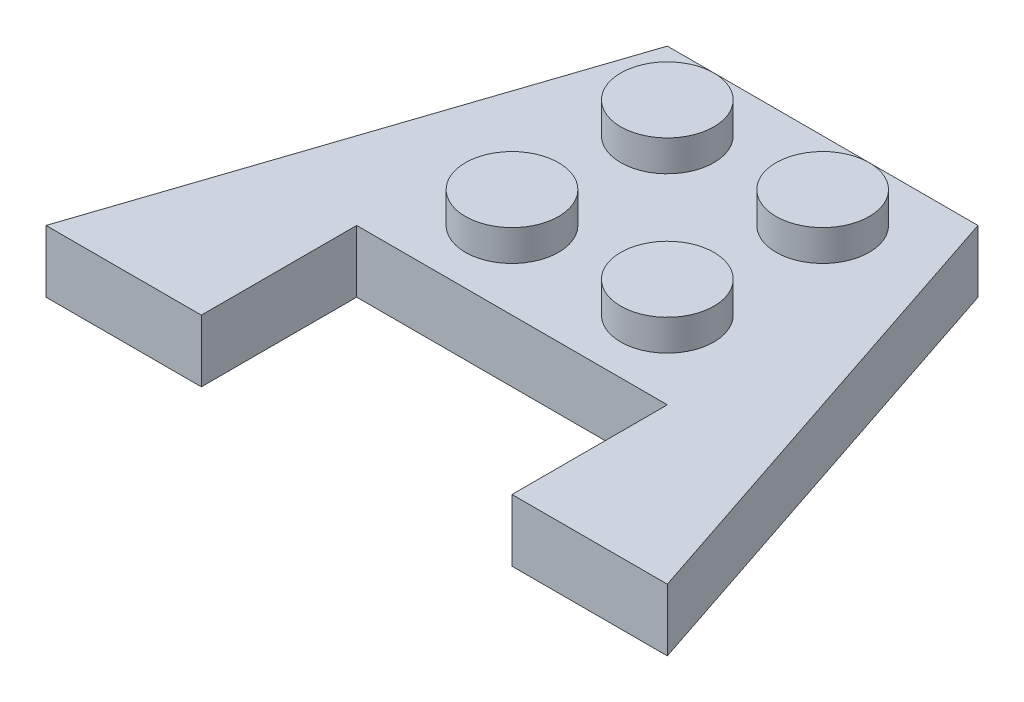
ISO-10303-21;
HEADER;
FILE_DESCRIPTION(('STEP AP214'),'2;1');
FILE_NAME('part.step','',(''),(''),'','','');
FILE_SCHEMA(('AUTOMOTIVE_DESIGN { 1 0 10303 214 1 1 1 1 }'));
ENDSEC;
DATA;
#1=APPLICATION_CONTEXT('core data for automotive mechanical design processes');
#2=APPLICATION_PROTOCOL_DEFINITION('international standard','automotive_design',2000,#1);
#3=PRODUCT_CONTEXT('',#1,'mechanical');
#4=PRODUCT('Part','Part','',(#3));
#5=PRODUCT_RELATED_PRODUCT_CATEGORY('part','',(#4));
#6=PRODUCT_DEFINITION_FORMATION('','',#4);
#7=PRODUCT_DEFINITION_CONTEXT('part definition',#1,'design');
#8=PRODUCT_DEFINITION('design','',#6,#7);
#9=PRODUCT_DEFINITION_SHAPE('','',#8);
#10=(LENGTH_UNIT() NAMED_UNIT(*) SI_UNIT(.MILLI.,.METRE.));
#11=(NAMED_UNIT(*) PLANE_ANGLE_UNIT() SI_UNIT($,.RADIAN.));
#12=(NAMED_UNIT(*) SI_UNIT($,.STERADIAN.) SOLID_ANGLE_UNIT());
#13=UNCERTAINTY_MEASURE_WITH_UNIT(LENGTH_MEASURE(1.E-05),#10,'distance_accuracy_value','');
#14=(GEOMETRIC_REPRESENTATION_CONTEXT(3) GLOBAL_UNCERTAINTY_ASSIGNED_CONTEXT((#13)) GLOBAL_UNIT_ASSIGNED_CONTEXT((#10,
#11,#12)) REPRESENTATION_CONTEXT('',''));
#15=CARTESIAN_POINT('',(0.,0.,0.));
#16=DIRECTION('',(0.,0.,1.));
#17=DIRECTION('',(1.,0.,0.));
#18=AXIS2_PLACEMENT_3D('',#15,#16,#17);
#19=CARTESIAN_POINT('',(20.,4.8,-12.));
#20=DIRECTION('',(0.,1.,0.));
#21=DIRECTION('',(0.,0.,1.));
#22=AXIS2_PLACEMENT_3D('',#19,#20,#21);
#23=PLANE('',#22);
#24=CARTESIAN_POINT('',(20.,4.8,-12.));
#25=DIRECTION('',(0.,1.,0.));
#26=DIRECTION('',(0.,0.,1.));
#27=AXIS2_PLACEMENT_3D('',#24,#25,#26);
#28=CIRCLE('',#27,2.4);
#29=CARTESIAN_POINT('',(20.,4.8,-9.6));
#30=VERTEX_POINT('',#29);
#31=EDGE_CURVE('E11',#30,#30,#28,.T.);
#32=ORIENTED_EDGE('',*,*,#31,.T.);
#33=EDGE_LOOP('',(#32));
#34=FACE_BOUND('',#33,.T.);
#35=ADVANCED_FACE('F38',(#34),#23,.T.);
#36=CARTESIAN_POINT('',(20.,4.8,-12.));
#37=DIRECTION('',(0.,-1.,0.));
#38=DIRECTION('',(0.,0.,-1.));
#39=AXIS2_PLACEMENT_3D('',#36,#37,#38);
#40=CYLINDRICAL_SURFACE('',#39,2.4);
#41=ORIENTED_EDGE('',*,*,#31,.F.);
#42=EDGE_LOOP('',(#41));
#43=FACE_BOUND('',#42,.T.);
#44=CARTESIAN_POINT('',(20.,3.2,-12.));
#45=DIRECTION('',(0.,1.,0.));
#46=DIRECTION('',(0.,0.,1.));
#47=AXIS2_PLACEMENT_3D('',#44,#45,#46);
#48=CIRCLE('',#47,2.4);
#49=CARTESIAN_POINT('',(20.,3.2,-9.6));
#50=VERTEX_POINT('',#49);
#51=EDGE_CURVE('E46',#50,#50,#48,.T.);
#52=ORIENTED_EDGE('',*,*,#51,.T.);
#53=EDGE_LOOP('',(#52));
#54=FACE_BOUND('',#53,.T.);
#55=ADVANCED_FACE('F210',(#43,#54),#40,.T.);
#56=CARTESIAN_POINT('',(12.,4.8,-12.));
#57=DIRECTION('',(0.,1.,0.));
#58=DIRECTION('',(0.,0.,1.));
#59=AXIS2_PLACEMENT_3D('',#56,#57,#58);
#60=PLANE('',#59);
#61=CARTESIAN_POINT('',(12.,4.8,-12.));
#62=DIRECTION('',(0.,1.,0.));
#63=DIRECTION('',(0.,0.,1.));
#64=AXIS2_PLACEMENT_3D('',#61,#62,#63);
#65=CIRCLE('',#64,2.4);
#66=CARTESIAN_POINT('',(12.,4.8,-9.6));
#67=VERTEX_POINT('',#66);
#68=EDGE_CURVE('E203',#67,#67,#65,.T.);
#69=ORIENTED_EDGE('',*,*,#68,.T.);
#70=EDGE_LOOP('',(#69));
#71=FACE_BOUND('',#70,.T.);
#72=ADVANCED_FACE('F234',(#71),#60,.T.);
#73=CARTESIAN_POINT('',(12.,4.8,-12.));
#74=DIRECTION('',(0.,-1.,0.));
#75=DIRECTION('',(0.,0.,-1.));
#76=AXIS2_PLACEMENT_3D('',#73,#74,#75);
#77=CYLINDRICAL_SURFACE('',#76,2.4);
#78=ORIENTED_EDGE('',*,*,#68,.F.);
#79=EDGE_LOOP('',(#78));
#80=FACE_BOUND('',#79,.T.);
#81=CARTESIAN_POINT('',(12.,3.2,-12.));
#82=DIRECTION('',(0.,1.,0.));
#83=DIRECTION('',(0.,0.,1.));
#84=AXIS2_PLACEMENT_3D('',#81,#82,#83);
#85=CIRCLE('',#84,2.4);
#86=CARTESIAN_POINT('',(12.,3.2,-9.6));
#87=VERTEX_POINT('',#86);
#88=EDGE_CURVE('E199',#87,#87,#85,.T.);
#89=ORIENTED_EDGE('',*,*,#88,.T.);
#90=EDGE_LOOP('',(#89));
#91=FACE_BOUND('',#90,.T.);
#92=ADVANCED_FACE('F240',(#80,#91),#77,.T.);
#93=CARTESIAN_POINT('',(0.,3.2,0.));
#94=DIRECTION('',(0.,0.,-1.));
#95=DIRECTION('',(-1.,0.,0.));
#96=AXIS2_PLACEMENT_3D('',#93,#94,#95);
#97=PLANE('',#96);
#98=DIRECTION('',(1.,0.,0.));
#99=VECTOR('',#98,1.);
#100=CARTESIAN_POINT('',(0.,0.,0.));
#101=LINE('',#100,#99);
#102=CARTESIAN_POINT('',(0.,0.,0.));
#103=VERTEX_POINT('',#102);
#104=CARTESIAN_POINT('',(8.,0.,0.));
#105=VERTEX_POINT('',#104);
#106=EDGE_CURVE('E153',#103,#105,#101,.T.);
#107=ORIENTED_EDGE('',*,*,#106,.T.);
#108=DIRECTION('',(0.,-1.,0.));
#109=VECTOR('',#108,1.);
#110=CARTESIAN_POINT('',(8.,3.2,0.));
#111=LINE('',#110,#109);
#112=CARTESIAN_POINT('',(8.,3.2,0.));
#113=VERTEX_POINT('',#112);
#114=EDGE_CURVE('E196',#113,#105,#111,.T.);
#115=ORIENTED_EDGE('',*,*,#114,.F.);
#116=DIRECTION('',(1.,0.,0.));
#117=VECTOR('',#116,1.);
#118=CARTESIAN_POINT('',(0.,3.2,0.));
#119=LINE('',#118,#117);
#120=CARTESIAN_POINT('',(0.,3.2,0.));
#121=VERTEX_POINT('',#120);
#122=EDGE_CURVE('E177',#121,#113,#119,.T.);
#123=ORIENTED_EDGE('',*,*,#122,.F.);
#124=DIRECTION('',(0.,-1.,0.));
#125=VECTOR('',#124,1.);
#126=CARTESIAN_POINT('',(0.,3.2,0.));
#127=LINE('',#126,#125);
#128=EDGE_CURVE('E149',#121,#103,#127,.T.);
#129=ORIENTED_EDGE('',*,*,#128,.T.);
#130=EDGE_LOOP('',(#107,#115,#123,#129));
#131=FACE_BOUND('',#130,.T.);
#132=ADVANCED_FACE('F246',(#131),#97,.F.);
#133=CARTESIAN_POINT('',(8.,3.2,0.));
#134=DIRECTION('',(-1.,0.,0.));
#135=DIRECTION('',(0.,0.,1.));
#136=AXIS2_PLACEMENT_3D('',#133,#134,#135);
#137=PLANE('',#136);
#138=DIRECTION('',(0.,0.,-1.));
#139=VECTOR('',#138,1.);
#140=CARTESIAN_POINT('',(8.,0.,0.));
#141=LINE('',#140,#139);
#142=CARTESIAN_POINT('',(8.,0.,-8.));
#143=VERTEX_POINT('',#142);
#144=EDGE_CURVE('E157',#105,#143,#141,.T.);
#145=ORIENTED_EDGE('',*,*,#144,.T.);
#146=DIRECTION('',(0.,-1.,0.));
#147=VECTOR('',#146,1.);
#148=CARTESIAN_POINT('',(8.,3.2,-8.));
#149=LINE('',#148,#147);
#150=CARTESIAN_POINT('',(8.,3.2,-8.));
#151=VERTEX_POINT('',#150);
#152=EDGE_CURVE('E192',#151,#143,#149,.T.);
#153=ORIENTED_EDGE('',*,*,#152,.F.);
#154=DIRECTION('',(0.,0.,-1.));
#155=VECTOR('',#154,1.);
#156=CARTESIAN_POINT('',(8.,3.2,0.));
#157=LINE('',#156,#155);
#158=EDGE_CURVE('E104',#113,#151,#157,.T.);
#159=ORIENTED_EDGE('',*,*,#158,.F.);
#160=ORIENTED_EDGE('',*,*,#114,.T.);
#161=EDGE_LOOP('',(#145,#153,#159,#160));
#162=FACE_BOUND('',#161,.T.);
#163=ADVANCED_FACE('F250',(#162),#137,.F.);
#164=CARTESIAN_POINT('',(8.,3.2,-8.));
#165=DIRECTION('',(0.,0.,-1.));
#166=DIRECTION('',(-1.,0.,0.));
#167=AXIS2_PLACEMENT_3D('',#164,#165,#166);
#168=PLANE('',#167);
#169=DIRECTION('',(1.,0.,0.));
#170=VECTOR('',#169,1.);
#171=CARTESIAN_POINT('',(8.,0.,-8.));
#172=LINE('',#171,#170);
#173=CARTESIAN_POINT('',(24.,0.,-8.));
#174=VERTEX_POINT('',#173);
#175=EDGE_CURVE('E161',#143,#174,#172,.T.);
#176=ORIENTED_EDGE('',*,*,#175,.T.);
#177=DIRECTION('',(0.,-1.,0.));
#178=VECTOR('',#177,1.);
#179=CARTESIAN_POINT('',(24.,3.2,-8.));
#180=LINE('',#179,#178);
#181=CARTESIAN_POINT('',(24.,3.2,-8.));
#182=VERTEX_POINT('',#181);
#183=EDGE_CURVE('E188',#182,#174,#180,.T.);
#184=ORIENTED_EDGE('',*,*,#183,.F.);
#185=DIRECTION('',(1.,0.,0.));
#186=VECTOR('',#185,1.);
#187=CARTESIAN_POINT('',(8.,3.2,-8.));
#188=LINE('',#187,#186);
#189=EDGE_CURVE('E583',#151,#182,#188,.T.);
#190=ORIENTED_EDGE('',*,*,#189,.F.);
#191=ORIENTED_EDGE('',*,*,#152,.T.);
#192=EDGE_LOOP('',(#176,#184,#190,#191));
#193=FACE_BOUND('',#192,.T.);
#194=ADVANCED_FACE('F254',(#193),#168,.F.);
#195=CARTESIAN_POINT('',(24.,3.2,-8.));
#196=DIRECTION('',(1.,0.,0.));
#197=DIRECTION('',(0.,0.,-1.));
#198=AXIS2_PLACEMENT_3D('',#195,#196,#197);
#199=PLANE('',#198);
#200=DIRECTION('',(0.,0.,1.));
#201=VECTOR('',#200,1.);
#202=CARTESIAN_POINT('',(24.,0.,-8.));
#203=LINE('',#202,#201);
#204=CARTESIAN_POINT('',(24.,0.,0.));
#205=VERTEX_POINT('',#204);
#206=EDGE_CURVE('E164',#174,#205,#203,.T.);
#207=ORIENTED_EDGE('',*,*,#206,.T.);
#208=DIRECTION('',(0.,-1.,0.));
#209=VECTOR('',#208,1.);
#210=CARTESIAN_POINT('',(24.,3.2,0.));
#211=LINE('',#210,#209);
#212=CARTESIAN_POINT('',(24.,3.2,0.));
#213=VERTEX_POINT('',#212);
#214=EDGE_CURVE('E184',#213,#205,#211,.T.);
#215=ORIENTED_EDGE('',*,*,#214,.F.);
#216=DIRECTION('',(0.,0.,1.));
#217=VECTOR('',#216,1.);
#218=CARTESIAN_POINT('',(24.,3.2,-8.));
#219=LINE('',#218,#217);
#220=EDGE_CURVE('E586',#182,#213,#219,.T.);
#221=ORIENTED_EDGE('',*,*,#220,.F.);
#222=ORIENTED_EDGE('',*,*,#183,.T.);
#223=EDGE_LOOP('',(#207,#215,#221,#222));
#224=FACE_BOUND('',#223,.T.);
#225=ADVANCED_FACE('F257',(#224),#199,.F.);
#226=CARTESIAN_POINT('',(24.,3.2,0.));
#227=DIRECTION('',(0.,0.,-1.));
#228=DIRECTION('',(-1.,0.,0.));
#229=AXIS2_PLACEMENT_3D('',#226,#227,#228);
#230=PLANE('',#229);
#231=DIRECTION('',(1.,0.,0.));
#232=VECTOR('',#231,1.);
#233=CARTESIAN_POINT('',(24.,0.,0.));
#234=LINE('',#233,#232);
#235=CARTESIAN_POINT('',(32.,0.,0.));
#236=VERTEX_POINT('',#235);
#237=EDGE_CURVE('E167',#205,#236,#234,.T.);
#238=ORIENTED_EDGE('',*,*,#237,.T.);
#239=DIRECTION('',(0.,-1.,0.));
#240=VECTOR('',#239,1.);
#241=CARTESIAN_POINT('',(32.,3.2,0.));
#242=LINE('',#241,#240);
#243=CARTESIAN_POINT('',(32.,3.2,0.));
#244=VERTEX_POINT('',#243);
#245=EDGE_CURVE('E142',#244,#236,#242,.T.);
#246=ORIENTED_EDGE('',*,*,#245,.F.);
#247=DIRECTION('',(1.,0.,0.));
#248=VECTOR('',#247,1.);
#249=CARTESIAN_POINT('',(24.,3.2,0.));
#250=LINE('',#249,#248);
#251=EDGE_CURVE('E128',#213,#244,#250,.T.);
#252=ORIENTED_EDGE('',*,*,#251,.F.);
#253=ORIENTED_EDGE('',*,*,#214,.T.);
#254=EDGE_LOOP('',(#238,#246,#252,#253));
#255=FACE_BOUND('',#254,.T.);
#256=ADVANCED_FACE('F261',(#255),#230,.F.);
#257=CARTESIAN_POINT('',(24.,3.2,-24.));
#258=DIRECTION('',(-0.948683298050514,0.,0.316227766016838));
#259=DIRECTION('',(0.316227766016838,0.,0.948683298050514));
#260=AXIS2_PLACEMENT_3D('',#257,#258,#259);
#261=PLANE('',#260);
#262=DIRECTION('',(-0.316227766016838,0.,-0.948683298050514));
#263=VECTOR('',#262,1.);
#264=CARTESIAN_POINT('',(24.,0.,-24.));
#265=LINE('',#264,#263);
#266=CARTESIAN_POINT('',(24.,0.,-24.));
#267=VERTEX_POINT('',#266);
#268=EDGE_CURVE('E138',#236,#267,#265,.T.);
#269=ORIENTED_EDGE('',*,*,#268,.T.);
#270=DIRECTION('',(0.,-1.,0.));
#271=VECTOR('',#270,1.);
#272=CARTESIAN_POINT('',(24.,3.2,-24.));
#273=LINE('',#272,#271);
#274=CARTESIAN_POINT('',(24.,3.2,-24.));
#275=VERTEX_POINT('',#274);
#276=EDGE_CURVE('E135',#275,#267,#273,.T.);
#277=ORIENTED_EDGE('',*,*,#276,.F.);
#278=DIRECTION('',(-0.316227766016838,0.,-0.948683298050514));
#279=VECTOR('',#278,1.);
#280=CARTESIAN_POINT('',(24.,3.2,-24.));
#281=LINE('',#280,#279);
#282=EDGE_CURVE('E120',#244,#275,#281,.T.);
#283=ORIENTED_EDGE('',*,*,#282,.F.);
#284=ORIENTED_EDGE('',*,*,#245,.T.);
#285=EDGE_LOOP('',(#269,#277,#283,#284));
#286=FACE_BOUND('',#285,.T.);
#287=ADVANCED_FACE('F136',(#286),#261,.F.);
#288=CARTESIAN_POINT('',(8.,3.2,-24.));
#289=DIRECTION('',(0.,0.,1.));
#290=DIRECTION('',(1.,0.,0.));
#291=AXIS2_PLACEMENT_3D('',#288,#289,#290);
#292=PLANE('',#291);
#293=DIRECTION('',(-1.,0.,0.));
#294=VECTOR('',#293,1.);
#295=CARTESIAN_POINT('',(8.,0.,-24.));
#296=LINE('',#295,#294);
#297=CARTESIAN_POINT('',(8.,0.,-24.));
#298=VERTEX_POINT('',#297);
#299=EDGE_CURVE('E172',#267,#298,#296,.T.);
#300=ORIENTED_EDGE('',*,*,#299,.T.);
#301=DIRECTION('',(0.,-1.,0.));
#302=VECTOR('',#301,1.);
#303=CARTESIAN_POINT('',(8.,3.2,-24.));
#304=LINE('',#303,#302);
#305=CARTESIAN_POINT('',(8.,3.2,-24.));
#306=VERTEX_POINT('',#305);
#307=EDGE_CURVE('E143',#306,#298,#304,.T.);
#308=ORIENTED_EDGE('',*,*,#307,.F.);
#309=DIRECTION('',(-1.,0.,0.));
#310=VECTOR('',#309,1.);
#311=CARTESIAN_POINT('',(8.,3.2,-24.));
#312=LINE('',#311,#310);
#313=EDGE_CURVE('E125',#275,#306,#312,.T.);
#314=ORIENTED_EDGE('',*,*,#313,.F.);
#315=ORIENTED_EDGE('',*,*,#276,.T.);
#316=EDGE_LOOP('',(#300,#308,#314,#315));
#317=FACE_BOUND('',#316,.T.);
#318=ADVANCED_FACE('F145',(#317),#292,.F.);
#319=CARTESIAN_POINT('',(0.,3.2,0.));
#320=DIRECTION('',(0.948683298050514,0.,0.316227766016838));
#321=DIRECTION('',(0.316227766016838,0.,-0.948683298050514));
#322=AXIS2_PLACEMENT_3D('',#319,#320,#321);
#323=PLANE('',#322);
#324=DIRECTION('',(-0.316227766016838,0.,0.948683298050514));
#325=VECTOR('',#324,1.);
#326=CARTESIAN_POINT('',(0.,0.,0.));
#327=LINE('',#326,#325);
#328=EDGE_CURVE('E95',#298,#103,#327,.T.);
#329=ORIENTED_EDGE('',*,*,#328,.T.);
#330=ORIENTED_EDGE('',*,*,#128,.F.);
#331=DIRECTION('',(-0.316227766016838,0.,0.948683298050514));
#332=VECTOR('',#331,1.);
#333=CARTESIAN_POINT('',(0.,3.2,0.));
#334=LINE('',#333,#332);
#335=EDGE_CURVE('E62',#306,#121,#334,.T.);
#336=ORIENTED_EDGE('',*,*,#335,.F.);
#337=ORIENTED_EDGE('',*,*,#307,.T.);
#338=EDGE_LOOP('',(#329,#330,#336,#337));
#339=FACE_BOUND('',#338,.T.);
#340=ADVANCED_FACE('F214',(#339),#323,.F.);
#341=CARTESIAN_POINT('',(0.,3.2,0.));
#342=DIRECTION('',(0.,1.,0.));
#343=DIRECTION('',(0.,0.,1.));
#344=AXIS2_PLACEMENT_3D('',#341,#342,#343);
#345=PLANE('',#344);
#346=CARTESIAN_POINT('',(20.,3.2,-20.));
#347=DIRECTION('',(0.,1.,0.));
#348=DIRECTION('',(0.,0.,1.));
#349=AXIS2_PLACEMENT_3D('',#346,#347,#348);
#350=CIRCLE('',#349,2.4);
#351=CARTESIAN_POINT('',(20.,3.2,-17.6));
#352=VERTEX_POINT('',#351);
#353=EDGE_CURVE('E563',#352,#352,#350,.T.);
#354=ORIENTED_EDGE('',*,*,#353,.F.);
#355=EDGE_LOOP('',(#354));
#356=FACE_BOUND('',#355,.T.);
#357=CARTESIAN_POINT('',(12.,3.2,-20.));
#358=DIRECTION('',(0.,1.,0.));
#359=DIRECTION('',(0.,0.,1.));
#360=AXIS2_PLACEMENT_3D('',#357,#358,#359);
#361=CIRCLE('',#360,2.4);
#362=CARTESIAN_POINT('',(12.,3.2,-17.6));
#363=VERTEX_POINT('',#362);
#364=EDGE_CURVE('E572',#363,#363,#361,.T.);
#365=ORIENTED_EDGE('',*,*,#364,.F.);
#366=EDGE_LOOP('',(#365));
#367=FACE_BOUND('',#366,.T.);
#368=ORIENTED_EDGE('',*,*,#122,.T.);
#369=ORIENTED_EDGE('',*,*,#158,.T.);
#370=ORIENTED_EDGE('',*,*,#189,.T.);
#371=ORIENTED_EDGE('',*,*,#220,.T.);
#372=ORIENTED_EDGE('',*,*,#251,.T.);
#373=ORIENTED_EDGE('',*,*,#282,.T.);
#374=ORIENTED_EDGE('',*,*,#313,.T.);
#375=ORIENTED_EDGE('',*,*,#335,.T.);
#376=EDGE_LOOP('',(#368,#369,#370,#371,#372,#373,#374,#375));
#377=FACE_BOUND('',#376,.T.);
#378=ORIENTED_EDGE('',*,*,#88,.F.);
#379=EDGE_LOOP('',(#378));
#380=FACE_BOUND('',#379,.T.);
#381=ORIENTED_EDGE('',*,*,#51,.F.);
#382=EDGE_LOOP('',(#381));
#383=FACE_BOUND('',#382,.T.);
#384=ADVANCED_FACE('F122',(#356,#367,#377,#380,#383),#345,.T.);
#385=CARTESIAN_POINT('',(0.,0.,0.));
#386=DIRECTION('',(0.,1.,0.));
#387=DIRECTION('',(0.,0.,1.));
#388=AXIS2_PLACEMENT_3D('',#385,#386,#387);
#389=PLANE('',#388);
#390=DIRECTION('',(-0.316227766016838,0.,0.948683298050514));
#391=VECTOR('',#390,1.);
#392=CARTESIAN_POINT('',(1.51789327688082,0.,0.505964425626941));
#393=LINE('',#392,#391);
#394=CARTESIAN_POINT('',(9.1532147520898,0.,-22.4));
#395=VERTEX_POINT('',#394);
#396=CARTESIAN_POINT('',(2.21988141875647,0.,-1.6));
#397=VERTEX_POINT('',#396);
#398=EDGE_CURVE('E537',#395,#397,#393,.T.);
#399=ORIENTED_EDGE('',*,*,#398,.T.);
#400=DIRECTION('',(1.,0.,0.));
#401=VECTOR('',#400,1.);
#402=CARTESIAN_POINT('',(0.,0.,-1.6));
#403=LINE('',#402,#401);
#404=CARTESIAN_POINT('',(6.4,0.,-1.6));
#405=VERTEX_POINT('',#404);
#406=EDGE_CURVE('E532',#397,#405,#403,.T.);
#407=ORIENTED_EDGE('',*,*,#406,.T.);
#408=DIRECTION('',(0.,0.,-1.));
#409=VECTOR('',#408,1.);
#410=CARTESIAN_POINT('',(6.4,0.,0.));
#411=LINE('',#410,#409);
#412=CARTESIAN_POINT('',(6.4,0.,-9.6));
#413=VERTEX_POINT('',#412);
#414=EDGE_CURVE('E536',#405,#413,#411,.T.);
#415=ORIENTED_EDGE('',*,*,#414,.T.);
#416=DIRECTION('',(1.,0.,0.));
#417=VECTOR('',#416,1.);
#418=CARTESIAN_POINT('',(8.,0.,-9.6));
#419=LINE('',#418,#417);
#420=CARTESIAN_POINT('',(25.6,0.,-9.6));
#421=VERTEX_POINT('',#420);
#422=EDGE_CURVE('E53',#413,#421,#419,.T.);
#423=ORIENTED_EDGE('',*,*,#422,.T.);
#424=DIRECTION('',(0.,0.,1.));
#425=VECTOR('',#424,1.);
#426=CARTESIAN_POINT('',(25.6,0.,-8.));
#427=LINE('',#426,#425);
#428=CARTESIAN_POINT('',(25.6,0.,-1.6));
#429=VERTEX_POINT('',#428);
#430=EDGE_CURVE('E554',#421,#429,#427,.T.);
#431=ORIENTED_EDGE('',*,*,#430,.T.);
#432=DIRECTION('',(1.,0.,0.));
#433=VECTOR('',#432,1.);
#434=CARTESIAN_POINT('',(24.,0.,-1.6));
#435=LINE('',#434,#433);
#436=CARTESIAN_POINT('',(29.7801185812435,0.,-1.6));
#437=VERTEX_POINT('',#436);
#438=EDGE_CURVE('E550',#429,#437,#435,.T.);
#439=ORIENTED_EDGE('',*,*,#438,.T.);
#440=DIRECTION('',(-0.316227766016838,0.,-0.948683298050514));
#441=VECTOR('',#440,1.);
#442=CARTESIAN_POINT('',(22.4821067231192,0.,-23.4940355743731));
#443=LINE('',#442,#441);
#444=CARTESIAN_POINT('',(22.8467852479102,0.,-22.4));
#445=VERTEX_POINT('',#444);
#446=EDGE_CURVE('E546',#437,#445,#443,.T.);
#447=ORIENTED_EDGE('',*,*,#446,.T.);
#448=DIRECTION('',(-1.,0.,0.));
#449=VECTOR('',#448,1.);
#450=CARTESIAN_POINT('',(8.,0.,-22.4));
#451=LINE('',#450,#449);
#452=EDGE_CURVE('E542',#445,#395,#451,.T.);
#453=ORIENTED_EDGE('',*,*,#452,.T.);
#454=EDGE_LOOP('',(#399,#407,#415,#423,#431,#439,#447,#453));
#455=FACE_BOUND('',#454,.T.);
#456=ORIENTED_EDGE('',*,*,#106,.F.);
#457=ORIENTED_EDGE('',*,*,#328,.F.);
#458=ORIENTED_EDGE('',*,*,#299,.F.);
#459=ORIENTED_EDGE('',*,*,#268,.F.);
#460=ORIENTED_EDGE('',*,*,#237,.F.);
#461=ORIENTED_EDGE('',*,*,#206,.F.);
#462=ORIENTED_EDGE('',*,*,#175,.F.);
#463=ORIENTED_EDGE('',*,*,#144,.F.);
#464=EDGE_LOOP('',(#456,#457,#458,#459,#460,#461,#462,#463));
#465=FACE_BOUND('',#464,.T.);
#466=ADVANCED_FACE('F213',(#455,#465),#389,.F.);
#467=CARTESIAN_POINT('',(12.,4.8,-20.));
#468=DIRECTION('',(0.,-1.,0.));
#469=DIRECTION('',(0.,0.,-1.));
#470=AXIS2_PLACEMENT_3D('',#467,#468,#469);
#471=CYLINDRICAL_SURFACE('',#470,2.4);
#472=CARTESIAN_POINT('',(12.,4.8,-20.));
#473=DIRECTION('',(0.,1.,0.));
#474=DIRECTION('',(0.,0.,1.));
#475=AXIS2_PLACEMENT_3D('',#472,#473,#474);
#476=CIRCLE('',#475,2.4);
#477=CARTESIAN_POINT('',(12.,4.8,-17.6));
#478=VERTEX_POINT('',#477);
#479=EDGE_CURVE('E158',#478,#478,#476,.T.);
#480=ORIENTED_EDGE('',*,*,#479,.F.);
#481=EDGE_LOOP('',(#480));
#482=FACE_BOUND('',#481,.T.);
#483=ORIENTED_EDGE('',*,*,#364,.T.);
#484=EDGE_LOOP('',(#483));
#485=FACE_BOUND('',#484,.T.);
#486=ADVANCED_FACE('F222',(#482,#485),#471,.T.);
#487=CARTESIAN_POINT('',(12.,4.8,-20.));
#488=DIRECTION('',(0.,1.,0.));
#489=DIRECTION('',(0.,0.,1.));
#490=AXIS2_PLACEMENT_3D('',#487,#488,#489);
#491=PLANE('',#490);
#492=ORIENTED_EDGE('',*,*,#479,.T.);
#493=EDGE_LOOP('',(#492));
#494=FACE_BOUND('',#493,.T.);
#495=ADVANCED_FACE('F287',(#494),#491,.T.);
#496=CARTESIAN_POINT('',(20.,4.8,-20.));
#497=DIRECTION('',(0.,-1.,0.));
#498=DIRECTION('',(0.,0.,-1.));
#499=AXIS2_PLACEMENT_3D('',#496,#497,#498);
#500=CYLINDRICAL_SURFACE('',#499,2.4);
#501=CARTESIAN_POINT('',(20.,4.8,-20.));
#502=DIRECTION('',(0.,1.,0.));
#503=DIRECTION('',(0.,0.,1.));
#504=AXIS2_PLACEMENT_3D('',#501,#502,#503);
#505=CIRCLE('',#504,2.4);
#506=CARTESIAN_POINT('',(20.,4.8,-17.6));
#507=VERTEX_POINT('',#506);
#508=EDGE_CURVE('E567',#507,#507,#505,.T.);
#509=ORIENTED_EDGE('',*,*,#508,.F.);
#510=EDGE_LOOP('',(#509));
#511=FACE_BOUND('',#510,.T.);
#512=ORIENTED_EDGE('',*,*,#353,.T.);
#513=EDGE_LOOP('',(#512));
#514=FACE_BOUND('',#513,.T.);
#515=ADVANCED_FACE('F296',(#511,#514),#500,.T.);
#516=CARTESIAN_POINT('',(20.,4.8,-20.));
#517=DIRECTION('',(0.,1.,0.));
#518=DIRECTION('',(0.,0.,1.));
#519=AXIS2_PLACEMENT_3D('',#516,#517,#518);
#520=PLANE('',#519);
#521=ORIENTED_EDGE('',*,*,#508,.T.);
#522=EDGE_LOOP('',(#521));
#523=FACE_BOUND('',#522,.T.);
#524=ADVANCED_FACE('F330',(#523),#520,.T.);
#525=CARTESIAN_POINT('',(20.,3.2,-12.));
#526=DIRECTION('',(0.,1.,0.));
#527=DIRECTION('',(0.,0.,1.));
#528=AXIS2_PLACEMENT_3D('',#525,#526,#527);
#529=PLANE('',#528);
#530=CARTESIAN_POINT('',(20.,3.2,-12.));
#531=DIRECTION('',(0.,1.,0.));
#532=DIRECTION('',(0.,0.,1.));
#533=AXIS2_PLACEMENT_3D('',#530,#531,#532);
#534=CIRCLE('',#533,0.799999999999999);
#535=CARTESIAN_POINT('',(20.,3.2,-11.2));
#536=VERTEX_POINT('',#535);
#537=EDGE_CURVE('E568',#536,#536,#534,.T.);
#538=ORIENTED_EDGE('',*,*,#537,.F.);
#539=EDGE_LOOP('',(#538));
#540=FACE_BOUND('',#539,.T.);
#541=ADVANCED_FACE('F339',(#540),#529,.F.);
#542=CARTESIAN_POINT('',(20.,4.8,-12.));
#543=DIRECTION('',(0.,-1.,0.));
#544=DIRECTION('',(0.,0.,-1.));
#545=AXIS2_PLACEMENT_3D('',#542,#543,#544);
#546=CYLINDRICAL_SURFACE('',#545,0.799999999999999);
#547=ORIENTED_EDGE('',*,*,#537,.T.);
#548=EDGE_LOOP('',(#547));
#549=FACE_BOUND('',#548,.T.);
#550=CARTESIAN_POINT('',(20.,1.6,-12.));
#551=DIRECTION('',(0.,1.,0.));
#552=DIRECTION('',(0.,0.,1.));
#553=AXIS2_PLACEMENT_3D('',#550,#551,#552);
#554=CIRCLE('',#553,0.799999999999999);
#555=CARTESIAN_POINT('',(20.,1.6,-11.2));
#556=VERTEX_POINT('',#555);
#557=EDGE_CURVE('E592',#556,#556,#554,.T.);
#558=ORIENTED_EDGE('',*,*,#557,.F.);
#559=EDGE_LOOP('',(#558));
#560=FACE_BOUND('',#559,.T.);
#561=ADVANCED_FACE('F352',(#549,#560),#546,.F.);
#562=CARTESIAN_POINT('',(12.,3.2,-12.));
#563=DIRECTION('',(0.,1.,0.));
#564=DIRECTION('',(0.,0.,1.));
#565=AXIS2_PLACEMENT_3D('',#562,#563,#564);
#566=PLANE('',#565);
#567=CARTESIAN_POINT('',(12.,3.2,-12.));
#568=DIRECTION('',(0.,1.,0.));
#569=DIRECTION('',(0.,0.,1.));
#570=AXIS2_PLACEMENT_3D('',#567,#568,#569);
#571=CIRCLE('',#570,0.799999999999999);
#572=CARTESIAN_POINT('',(12.,3.2,-11.2));
#573=VERTEX_POINT('',#572);
#574=EDGE_CURVE('E596',#573,#573,#571,.T.);
#575=ORIENTED_EDGE('',*,*,#574,.F.);
#576=EDGE_LOOP('',(#575));
#577=FACE_BOUND('',#576,.T.);
#578=ADVANCED_FACE('F360',(#577),#566,.F.);
#579=CARTESIAN_POINT('',(12.,4.8,-12.));
#580=DIRECTION('',(0.,-1.,0.));
#581=DIRECTION('',(0.,0.,-1.));
#582=AXIS2_PLACEMENT_3D('',#579,#580,#581);
#583=CYLINDRICAL_SURFACE('',#582,0.799999999999999);
#584=ORIENTED_EDGE('',*,*,#574,.T.);
#585=EDGE_LOOP('',(#584));
#586=FACE_BOUND('',#585,.T.);
#587=CARTESIAN_POINT('',(12.,1.6,-12.));
#588=DIRECTION('',(0.,1.,0.));
#589=DIRECTION('',(0.,0.,1.));
#590=AXIS2_PLACEMENT_3D('',#587,#588,#589);
#591=CIRCLE('',#590,0.799999999999999);
#592=CARTESIAN_POINT('',(12.,1.6,-11.2));
#593=VERTEX_POINT('',#592);
#594=EDGE_CURVE('E600',#593,#593,#591,.T.);
#595=ORIENTED_EDGE('',*,*,#594,.F.);
#596=EDGE_LOOP('',(#595));
#597=FACE_BOUND('',#596,.T.);
#598=ADVANCED_FACE('F369',(#586,#597),#583,.F.);
#599=CARTESIAN_POINT('',(0.,3.2,-1.6));
#600=DIRECTION('',(0.,0.,-1.));
#601=DIRECTION('',(-1.,0.,0.));
#602=AXIS2_PLACEMENT_3D('',#599,#600,#601);
#603=PLANE('',#602);
#604=ORIENTED_EDGE('',*,*,#406,.F.);
#605=DIRECTION('',(0.,-1.,0.));
#606=VECTOR('',#605,1.);
#607=CARTESIAN_POINT('',(2.21988141875647,3.2,-1.6));
#608=LINE('',#607,#606);
#609=CARTESIAN_POINT('',(2.21988141875647,1.6,-1.6));
#610=VERTEX_POINT('',#609);
#611=EDGE_CURVE('E630',#610,#397,#608,.T.);
#612=ORIENTED_EDGE('',*,*,#611,.F.);
#613=DIRECTION('',(1.,0.,0.));
#614=VECTOR('',#613,1.);
#615=CARTESIAN_POINT('',(0.,1.6,-1.6));
#616=LINE('',#615,#614);
#617=CARTESIAN_POINT('',(6.4,1.6,-1.6));
#618=VERTEX_POINT('',#617);
#619=EDGE_CURVE('E541',#610,#618,#616,.T.);
#620=ORIENTED_EDGE('',*,*,#619,.T.);
#621=DIRECTION('',(0.,-1.,0.));
#622=VECTOR('',#621,1.);
#623=CARTESIAN_POINT('',(6.4,3.2,-1.6));
#624=LINE('',#623,#622);
#625=EDGE_CURVE('E604',#618,#405,#624,.T.);
#626=ORIENTED_EDGE('',*,*,#625,.T.);
#627=EDGE_LOOP('',(#604,#612,#620,#626));
#628=FACE_BOUND('',#627,.T.);
#629=ADVANCED_FACE('F378',(#628),#603,.T.);
#630=CARTESIAN_POINT('',(6.4,3.2,0.));
#631=DIRECTION('',(-1.,0.,0.));
#632=DIRECTION('',(0.,0.,1.));
#633=AXIS2_PLACEMENT_3D('',#630,#631,#632);
#634=PLANE('',#633);
#635=ORIENTED_EDGE('',*,*,#414,.F.);
#636=ORIENTED_EDGE('',*,*,#625,.F.);
#637=DIRECTION('',(0.,0.,-1.));
#638=VECTOR('',#637,1.);
#639=CARTESIAN_POINT('',(6.4,1.6,0.));
#640=LINE('',#639,#638);
#641=CARTESIAN_POINT('',(6.4,1.6,-9.6));
#642=VERTEX_POINT('',#641);
#643=EDGE_CURVE('E657',#618,#642,#640,.T.);
#644=ORIENTED_EDGE('',*,*,#643,.T.);
#645=DIRECTION('',(0.,-1.,0.));
#646=VECTOR('',#645,1.);
#647=CARTESIAN_POINT('',(6.4,3.2,-9.6));
#648=LINE('',#647,#646);
#649=EDGE_CURVE('E608',#642,#413,#648,.T.);
#650=ORIENTED_EDGE('',*,*,#649,.T.);
#651=EDGE_LOOP('',(#635,#636,#644,#650));
#652=FACE_BOUND('',#651,.T.);
#653=ADVANCED_FACE('F387',(#652),#634,.T.);
#654=CARTESIAN_POINT('',(8.,3.2,-9.6));
#655=DIRECTION('',(0.,0.,-1.));
#656=DIRECTION('',(-1.,0.,0.));
#657=AXIS2_PLACEMENT_3D('',#654,#655,#656);
#658=PLANE('',#657);
#659=ORIENTED_EDGE('',*,*,#422,.F.);
#660=ORIENTED_EDGE('',*,*,#649,.F.);
#661=DIRECTION('',(1.,0.,0.));
#662=VECTOR('',#661,1.);
#663=CARTESIAN_POINT('',(8.,1.6,-9.6));
#664=LINE('',#663,#662);
#665=CARTESIAN_POINT('',(25.6,1.6,-9.6));
#666=VERTEX_POINT('',#665);
#667=EDGE_CURVE('E653',#642,#666,#664,.T.);
#668=ORIENTED_EDGE('',*,*,#667,.T.);
#669=DIRECTION('',(0.,-1.,0.));
#670=VECTOR('',#669,1.);
#671=CARTESIAN_POINT('',(25.6,3.2,-9.6));
#672=LINE('',#671,#670);
#673=EDGE_CURVE('E611',#666,#421,#672,.T.);
#674=ORIENTED_EDGE('',*,*,#673,.T.);
#675=EDGE_LOOP('',(#659,#660,#668,#674));
#676=FACE_BOUND('',#675,.T.);
#677=ADVANCED_FACE('F396',(#676),#658,.T.);
#678=CARTESIAN_POINT('',(25.6,3.2,-8.));
#679=DIRECTION('',(1.,0.,0.));
#680=DIRECTION('',(0.,0.,-1.));
#681=AXIS2_PLACEMENT_3D('',#678,#679,#680);
#682=PLANE('',#681);
#683=ORIENTED_EDGE('',*,*,#430,.F.);
#684=ORIENTED_EDGE('',*,*,#673,.F.);
#685=DIRECTION('',(0.,0.,1.));
#686=VECTOR('',#685,1.);
#687=CARTESIAN_POINT('',(25.6,1.6,-8.));
#688=LINE('',#687,#686);
#689=CARTESIAN_POINT('',(25.6,1.6,-1.6));
#690=VERTEX_POINT('',#689);
#691=EDGE_CURVE('E649',#666,#690,#688,.T.);
#692=ORIENTED_EDGE('',*,*,#691,.T.);
#693=DIRECTION('',(0.,-1.,0.));
#694=VECTOR('',#693,1.);
#695=CARTESIAN_POINT('',(25.6,3.2,-1.6));
#696=LINE('',#695,#694);
#697=EDGE_CURVE('E614',#690,#429,#696,.T.);
#698=ORIENTED_EDGE('',*,*,#697,.T.);
#699=EDGE_LOOP('',(#683,#684,#692,#698));
#700=FACE_BOUND('',#699,.T.);
#701=ADVANCED_FACE('F405',(#700),#682,.T.);
#702=CARTESIAN_POINT('',(24.,3.2,-1.6));
#703=DIRECTION('',(0.,0.,-1.));
#704=DIRECTION('',(-1.,0.,0.));
#705=AXIS2_PLACEMENT_3D('',#702,#703,#704);
#706=PLANE('',#705);
#707=ORIENTED_EDGE('',*,*,#438,.F.);
#708=ORIENTED_EDGE('',*,*,#697,.F.);
#709=DIRECTION('',(1.,0.,0.));
#710=VECTOR('',#709,1.);
#711=CARTESIAN_POINT('',(24.,1.6,-1.6));
#712=LINE('',#711,#710);
#713=CARTESIAN_POINT('',(29.7801185812435,1.6,-1.6));
#714=VERTEX_POINT('',#713);
#715=EDGE_CURVE('E645',#690,#714,#712,.T.);
#716=ORIENTED_EDGE('',*,*,#715,.T.);
#717=DIRECTION('',(0.,-1.,0.));
#718=VECTOR('',#717,1.);
#719=CARTESIAN_POINT('',(29.7801185812435,3.2,-1.6));
#720=LINE('',#719,#718);
#721=EDGE_CURVE('E618',#714,#437,#720,.T.);
#722=ORIENTED_EDGE('',*,*,#721,.T.);
#723=EDGE_LOOP('',(#707,#708,#716,#722));
#724=FACE_BOUND('',#723,.T.);
#725=ADVANCED_FACE('F413',(#724),#706,.T.);
#726=CARTESIAN_POINT('',(22.4821067231192,3.2,-23.4940355743731));
#727=DIRECTION('',(-0.948683298050514,0.,0.316227766016838));
#728=DIRECTION('',(0.316227766016838,0.,0.948683298050514));
#729=AXIS2_PLACEMENT_3D('',#726,#727,#728);
#730=PLANE('',#729);
#731=ORIENTED_EDGE('',*,*,#446,.F.);
#732=ORIENTED_EDGE('',*,*,#721,.F.);
#733=DIRECTION('',(-0.316227766016838,0.,-0.948683298050514));
#734=VECTOR('',#733,1.);
#735=CARTESIAN_POINT('',(22.4821067231192,1.6,-23.4940355743731));
#736=LINE('',#735,#734);
#737=CARTESIAN_POINT('',(22.8467852479102,1.6,-22.4));
#738=VERTEX_POINT('',#737);
#739=EDGE_CURVE('E641',#714,#738,#736,.T.);
#740=ORIENTED_EDGE('',*,*,#739,.T.);
#741=DIRECTION('',(0.,-1.,0.));
#742=VECTOR('',#741,1.);
#743=CARTESIAN_POINT('',(22.8467852479102,3.2,-22.4));
#744=LINE('',#743,#742);
#745=EDGE_CURVE('E622',#738,#445,#744,.T.);
#746=ORIENTED_EDGE('',*,*,#745,.T.);
#747=EDGE_LOOP('',(#731,#732,#740,#746));
#748=FACE_BOUND('',#747,.T.);
#749=ADVANCED_FACE('F422',(#748),#730,.T.);
#750=CARTESIAN_POINT('',(8.,3.2,-22.4));
#751=DIRECTION('',(0.,0.,1.));
#752=DIRECTION('',(1.,0.,0.));
#753=AXIS2_PLACEMENT_3D('',#750,#751,#752);
#754=PLANE('',#753);
#755=ORIENTED_EDGE('',*,*,#452,.F.);
#756=ORIENTED_EDGE('',*,*,#745,.F.);
#757=DIRECTION('',(-1.,0.,0.));
#758=VECTOR('',#757,1.);
#759=CARTESIAN_POINT('',(8.,1.6,-22.4));
#760=LINE('',#759,#758);
#761=CARTESIAN_POINT('',(9.1532147520898,1.6,-22.4));
#762=VERTEX_POINT('',#761);
#763=EDGE_CURVE('E637',#738,#762,#760,.T.);
#764=ORIENTED_EDGE('',*,*,#763,.T.);
#765=DIRECTION('',(0.,-1.,0.));
#766=VECTOR('',#765,1.);
#767=CARTESIAN_POINT('',(9.1532147520898,3.2,-22.4));
#768=LINE('',#767,#766);
#769=EDGE_CURVE('E626',#762,#395,#768,.T.);
#770=ORIENTED_EDGE('',*,*,#769,.T.);
#771=EDGE_LOOP('',(#755,#756,#764,#770));
#772=FACE_BOUND('',#771,.T.);
#773=ADVANCED_FACE('F431',(#772),#754,.T.);
#774=CARTESIAN_POINT('',(1.51789327688082,3.2,0.505964425626941));
#775=DIRECTION('',(0.948683298050514,0.,0.316227766016838));
#776=DIRECTION('',(0.316227766016838,0.,-0.948683298050514));
#777=AXIS2_PLACEMENT_3D('',#774,#775,#776);
#778=PLANE('',#777);
#779=ORIENTED_EDGE('',*,*,#398,.F.);
#780=ORIENTED_EDGE('',*,*,#769,.F.);
#781=DIRECTION('',(-0.316227766016838,0.,0.948683298050514));
#782=VECTOR('',#781,1.);
#783=CARTESIAN_POINT('',(1.51789327688082,1.6,0.505964425626941));
#784=LINE('',#783,#782);
#785=EDGE_CURVE('E633',#762,#610,#784,.T.);
#786=ORIENTED_EDGE('',*,*,#785,.T.);
#787=ORIENTED_EDGE('',*,*,#611,.T.);
#788=EDGE_LOOP('',(#779,#780,#786,#787));
#789=FACE_BOUND('',#788,.T.);
#790=ADVANCED_FACE('F440',(#789),#778,.T.);
#791=CARTESIAN_POINT('',(0.,1.6,0.));
#792=DIRECTION('',(0.,1.,0.));
#793=DIRECTION('',(0.,0.,1.));
#794=AXIS2_PLACEMENT_3D('',#791,#792,#793);
#795=PLANE('',#794);
#796=CARTESIAN_POINT('',(20.,1.6,-20.));
#797=DIRECTION('',(0.,1.,0.));
#798=DIRECTION('',(0.,0.,1.));
#799=AXIS2_PLACEMENT_3D('',#796,#797,#798);
#800=CIRCLE('',#799,0.799999999999999);
#801=CARTESIAN_POINT('',(20.,1.6,-19.2));
#802=VERTEX_POINT('',#801);
#803=EDGE_CURVE('E520',#802,#802,#800,.T.);
#804=ORIENTED_EDGE('',*,*,#803,.T.);
#805=EDGE_LOOP('',(#804));
#806=FACE_BOUND('',#805,.T.);
#807=CARTESIAN_POINT('',(12.,1.6,-20.));
#808=DIRECTION('',(0.,1.,0.));
#809=DIRECTION('',(0.,0.,1.));
#810=AXIS2_PLACEMENT_3D('',#807,#808,#809);
#811=CIRCLE('',#810,0.799999999999999);
#812=CARTESIAN_POINT('',(12.,1.6,-19.2));
#813=VERTEX_POINT('',#812);
#814=EDGE_CURVE('E519',#813,#813,#811,.T.);
#815=ORIENTED_EDGE('',*,*,#814,.T.);
#816=EDGE_LOOP('',(#815));
#817=FACE_BOUND('',#816,.T.);
#818=ORIENTED_EDGE('',*,*,#619,.F.);
#819=ORIENTED_EDGE('',*,*,#785,.F.);
#820=ORIENTED_EDGE('',*,*,#763,.F.);
#821=ORIENTED_EDGE('',*,*,#739,.F.);
#822=ORIENTED_EDGE('',*,*,#715,.F.);
#823=ORIENTED_EDGE('',*,*,#691,.F.);
#824=ORIENTED_EDGE('',*,*,#667,.F.);
#825=ORIENTED_EDGE('',*,*,#643,.F.);
#826=EDGE_LOOP('',(#818,#819,#820,#821,#822,#823,#824,#825));
#827=FACE_BOUND('',#826,.T.);
#828=ORIENTED_EDGE('',*,*,#594,.T.);
#829=EDGE_LOOP('',(#828));
#830=FACE_BOUND('',#829,.T.);
#831=ORIENTED_EDGE('',*,*,#557,.T.);
#832=EDGE_LOOP('',(#831));
#833=FACE_BOUND('',#832,.T.);
#834=ADVANCED_FACE('F449',(#806,#817,#827,#830,#833),#795,.F.);
#835=CARTESIAN_POINT('',(12.,4.8,-20.));
#836=DIRECTION('',(0.,-1.,0.));
#837=DIRECTION('',(0.,0.,-1.));
#838=AXIS2_PLACEMENT_3D('',#835,#836,#837);
#839=CYLINDRICAL_SURFACE('',#838,0.799999999999999);
#840=CARTESIAN_POINT('',(12.,3.2,-20.));
#841=DIRECTION('',(0.,1.,0.));
#842=DIRECTION('',(0.,0.,1.));
#843=AXIS2_PLACEMENT_3D('',#840,#841,#842);
#844=CIRCLE('',#843,0.799999999999999);
#845=CARTESIAN_POINT('',(12.,3.2,-19.2));
#846=VERTEX_POINT('',#845);
#847=EDGE_CURVE('E525',#846,#846,#844,.T.);
#848=ORIENTED_EDGE('',*,*,#847,.T.);
#849=EDGE_LOOP('',(#848));
#850=FACE_BOUND('',#849,.T.);
#851=ORIENTED_EDGE('',*,*,#814,.F.);
#852=EDGE_LOOP('',(#851));
#853=FACE_BOUND('',#852,.T.);
#854=ADVANCED_FACE('F458',(#850,#853),#839,.F.);
#855=CARTESIAN_POINT('',(12.,3.2,-20.));
#856=DIRECTION('',(0.,1.,0.));
#857=DIRECTION('',(0.,0.,1.));
#858=AXIS2_PLACEMENT_3D('',#855,#856,#857);
#859=PLANE('',#858);
#860=ORIENTED_EDGE('',*,*,#847,.F.);
#861=EDGE_LOOP('',(#860));
#862=FACE_BOUND('',#861,.T.);
#863=ADVANCED_FACE('F467',(#862),#859,.F.);
#864=CARTESIAN_POINT('',(20.,4.8,-20.));
#865=DIRECTION('',(0.,-1.,0.));
#866=DIRECTION('',(0.,0.,-1.));
#867=AXIS2_PLACEMENT_3D('',#864,#865,#866);
#868=CYLINDRICAL_SURFACE('',#867,0.799999999999999);
#869=CARTESIAN_POINT('',(20.,3.2,-20.));
#870=DIRECTION('',(0.,1.,0.));
#871=DIRECTION('',(0.,0.,1.));
#872=AXIS2_PLACEMENT_3D('',#869,#870,#871);
#873=CIRCLE('',#872,0.799999999999999);
#874=CARTESIAN_POINT('',(20.,3.2,-19.2));
#875=VERTEX_POINT('',#874);
#876=EDGE_CURVE('E517',#875,#875,#873,.T.);
#877=ORIENTED_EDGE('',*,*,#876,.T.);
#878=EDGE_LOOP('',(#877));
#879=FACE_BOUND('',#878,.T.);
#880=ORIENTED_EDGE('',*,*,#803,.F.);
#881=EDGE_LOOP('',(#880));
#882=FACE_BOUND('',#881,.T.);
#883=ADVANCED_FACE('F476',(#879,#882),#868,.F.);
#884=CARTESIAN_POINT('',(20.,3.2,-20.));
#885=DIRECTION('',(0.,1.,0.));
#886=DIRECTION('',(0.,0.,1.));
#887=AXIS2_PLACEMENT_3D('',#884,#885,#886);
#888=PLANE('',#887);
#889=ORIENTED_EDGE('',*,*,#876,.F.);
#890=EDGE_LOOP('',(#889));
#891=FACE_BOUND('',#890,.T.);
#892=ADVANCED_FACE('F485',(#891),#888,.F.);
#893=CLOSED_SHELL('',(#35,#55,#72,#92,#132,#163,#194,#225,#256,#287,#318,#340,#384,#466,#486,
#495,#515,#524,#541,#561,#578,#598,#629,#653,#677,#701,#725,#749,#773,#790,#834,#854,#863,#883,#892));
#894=MANIFOLD_SOLID_BREP('B2',#893);
#895=ADVANCED_BREP_SHAPE_REPRESENTATION('',(#18,#894),#14);
#896=SHAPE_DEFINITION_REPRESENTATION(#9,#895);
ENDSEC;
END-ISO-10303-21;
